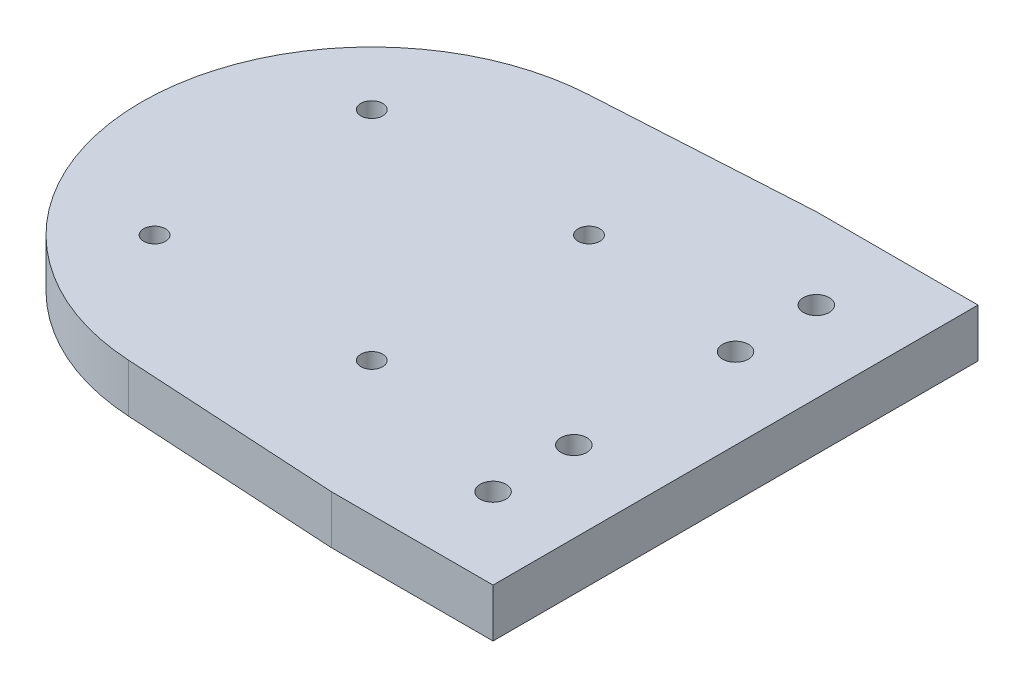
ISO-10303-21;
HEADER;
FILE_DESCRIPTION(('STEP AP214'),'2;1');
FILE_NAME('part.step','',(''),(''),'','','');
FILE_SCHEMA(('AUTOMOTIVE_DESIGN { 1 0 10303 214 1 1 1 1 }'));
ENDSEC;
DATA;
#1=APPLICATION_CONTEXT('core data for automotive mechanical design processes');
#2=APPLICATION_PROTOCOL_DEFINITION('international standard','automotive_design',2000,#1);
#3=PRODUCT_CONTEXT('',#1,'mechanical');
#4=PRODUCT('Part','Part','',(#3));
#5=PRODUCT_RELATED_PRODUCT_CATEGORY('part','',(#4));
#6=PRODUCT_DEFINITION_FORMATION('','',#4);
#7=PRODUCT_DEFINITION_CONTEXT('part definition',#1,'design');
#8=PRODUCT_DEFINITION('design','',#6,#7);
#9=PRODUCT_DEFINITION_SHAPE('','',#8);
#10=(LENGTH_UNIT() NAMED_UNIT(*) SI_UNIT(.MILLI.,.METRE.));
#11=(NAMED_UNIT(*) PLANE_ANGLE_UNIT() SI_UNIT($,.RADIAN.));
#12=(NAMED_UNIT(*) SI_UNIT($,.STERADIAN.) SOLID_ANGLE_UNIT());
#13=UNCERTAINTY_MEASURE_WITH_UNIT(LENGTH_MEASURE(1.E-05),#10,'distance_accuracy_value','');
#14=(GEOMETRIC_REPRESENTATION_CONTEXT(3) GLOBAL_UNCERTAINTY_ASSIGNED_CONTEXT((#13)) GLOBAL_UNIT_ASSIGNED_CONTEXT((#10,
#11,#12)) REPRESENTATION_CONTEXT('',''));
#15=CARTESIAN_POINT('',(0.,0.,0.));
#16=DIRECTION('',(0.,0.,1.));
#17=DIRECTION('',(1.,0.,0.));
#18=AXIS2_PLACEMENT_3D('',#15,#16,#17);
#19=CARTESIAN_POINT('',(45.,6.,-30.));
#20=DIRECTION('',(0.,0.,1.));
#21=DIRECTION('',(1.,0.,0.));
#22=AXIS2_PLACEMENT_3D('',#19,#20,#21);
#23=PLANE('',#22);
#24=DIRECTION('',(-1.,0.,0.));
#25=VECTOR('',#24,1.);
#26=CARTESIAN_POINT('',(45.,0.,-30.));
#27=LINE('',#26,#25);
#28=CARTESIAN_POINT('',(45.,0.,-30.));
#29=VERTEX_POINT('',#28);
#30=CARTESIAN_POINT('',(25.,0.,-30.));
#31=VERTEX_POINT('',#30);
#32=EDGE_CURVE('E131',#29,#31,#27,.T.);
#33=ORIENTED_EDGE('',*,*,#32,.T.);
#34=DIRECTION('',(0.,-1.,0.));
#35=VECTOR('',#34,1.);
#36=CARTESIAN_POINT('',(25.,6.,-30.));
#37=LINE('',#36,#35);
#38=CARTESIAN_POINT('',(25.,6.,-30.));
#39=VERTEX_POINT('',#38);
#40=EDGE_CURVE('E11',#39,#31,#37,.T.);
#41=ORIENTED_EDGE('',*,*,#40,.F.);
#42=DIRECTION('',(-1.,0.,0.));
#43=VECTOR('',#42,1.);
#44=CARTESIAN_POINT('',(45.,6.,-30.));
#45=LINE('',#44,#43);
#46=CARTESIAN_POINT('',(45.,6.,-30.));
#47=VERTEX_POINT('',#46);
#48=EDGE_CURVE('E148',#47,#39,#45,.T.);
#49=ORIENTED_EDGE('',*,*,#48,.F.);
#50=DIRECTION('',(0.,-1.,0.));
#51=VECTOR('',#50,1.);
#52=CARTESIAN_POINT('',(45.,6.,-30.));
#53=LINE('',#52,#51);
#54=EDGE_CURVE('E127',#47,#29,#53,.T.);
#55=ORIENTED_EDGE('',*,*,#54,.T.);
#56=EDGE_LOOP('',(#33,#41,#49,#55));
#57=FACE_BOUND('',#56,.T.);
#58=ADVANCED_FACE('F42',(#57),#23,.F.);
#59=CARTESIAN_POINT('',(25.,6.,-30.));
#60=DIRECTION('',(0.0579812094772124,0.,0.998317674564344));
#61=DIRECTION('',(0.998317674564344,0.,-0.0579812094772124));
#62=AXIS2_PLACEMENT_3D('',#59,#60,#61);
#63=PLANE('',#62);
#64=DIRECTION('',(-0.998317674564344,0.,0.0579812094772124));
#65=VECTOR('',#64,1.);
#66=CARTESIAN_POINT('',(25.,0.,-30.));
#67=LINE('',#66,#65);
#68=CARTESIAN_POINT('',(-1.65246447010055,0.,-28.4520537250838));
#69=VERTEX_POINT('',#68);
#70=EDGE_CURVE('E135',#31,#69,#67,.T.);
#71=ORIENTED_EDGE('',*,*,#70,.T.);
#72=DIRECTION('',(0.,-1.,0.));
#73=VECTOR('',#72,1.);
#74=CARTESIAN_POINT('',(-1.65246447010055,6.,-28.4520537250838));
#75=LINE('',#74,#73);
#76=CARTESIAN_POINT('',(-1.65246447010055,6.,-28.4520537250838));
#77=VERTEX_POINT('',#76);
#78=EDGE_CURVE('E51',#77,#69,#75,.T.);
#79=ORIENTED_EDGE('',*,*,#78,.F.);
#80=DIRECTION('',(-0.998317674564344,0.,0.0579812094772124));
#81=VECTOR('',#80,1.);
#82=CARTESIAN_POINT('',(25.,6.,-30.));
#83=LINE('',#82,#81);
#84=EDGE_CURVE('E96',#39,#77,#83,.T.);
#85=ORIENTED_EDGE('',*,*,#84,.F.);
#86=ORIENTED_EDGE('',*,*,#40,.T.);
#87=EDGE_LOOP('',(#71,#79,#85,#86));
#88=FACE_BOUND('',#87,.T.);
#89=ADVANCED_FACE('F177',(#88),#63,.F.);
#90=CARTESIAN_POINT('',(0.,6.,0.));
#91=DIRECTION('',(0.,-1.,0.));
#92=DIRECTION('',(0.,0.,-1.));
#93=AXIS2_PLACEMENT_3D('',#90,#91,#92);
#94=CYLINDRICAL_SURFACE('',#93,28.5);
#95=CARTESIAN_POINT('',(0.,0.,0.));
#96=DIRECTION('',(0.,1.,0.));
#97=DIRECTION('',(0.,0.,1.));
#98=AXIS2_PLACEMENT_3D('',#95,#96,#97);
#99=CIRCLE('',#98,28.5);
#100=CARTESIAN_POINT('',(-1.65246447010056,0.,28.4520537250838));
#101=VERTEX_POINT('',#100);
#102=EDGE_CURVE('E139',#69,#101,#99,.T.);
#103=ORIENTED_EDGE('',*,*,#102,.T.);
#104=DIRECTION('',(0.,-1.,0.));
#105=VECTOR('',#104,1.);
#106=CARTESIAN_POINT('',(-1.65246447010056,6.,28.4520537250838));
#107=LINE('',#106,#105);
#108=CARTESIAN_POINT('',(-1.65246447010056,6.,28.4520537250838));
#109=VERTEX_POINT('',#108);
#110=EDGE_CURVE('E120',#109,#101,#107,.T.);
#111=ORIENTED_EDGE('',*,*,#110,.F.);
#112=CARTESIAN_POINT('',(0.,6.,0.));
#113=DIRECTION('',(0.,1.,0.));
#114=DIRECTION('',(0.,0.,1.));
#115=AXIS2_PLACEMENT_3D('',#112,#113,#114);
#116=CIRCLE('',#115,28.5);
#117=EDGE_CURVE('E109',#77,#109,#116,.T.);
#118=ORIENTED_EDGE('',*,*,#117,.F.);
#119=ORIENTED_EDGE('',*,*,#78,.T.);
#120=EDGE_LOOP('',(#103,#111,#118,#119));
#121=FACE_BOUND('',#120,.T.);
#122=ADVANCED_FACE('F158',(#121),#94,.T.);
#123=CARTESIAN_POINT('',(25.,6.,30.));
#124=DIRECTION('',(0.0579812094772124,0.,-0.998317674564344));
#125=DIRECTION('',(-0.998317674564344,0.,-0.0579812094772124));
#126=AXIS2_PLACEMENT_3D('',#123,#124,#125);
#127=PLANE('',#126);
#128=DIRECTION('',(0.998317674564344,0.,0.0579812094772124));
#129=VECTOR('',#128,1.);
#130=CARTESIAN_POINT('',(25.,0.,30.));
#131=LINE('',#130,#129);
#132=CARTESIAN_POINT('',(25.,0.,30.));
#133=VERTEX_POINT('',#132);
#134=EDGE_CURVE('E118',#101,#133,#131,.T.);
#135=ORIENTED_EDGE('',*,*,#134,.T.);
#136=DIRECTION('',(0.,-1.,0.));
#137=VECTOR('',#136,1.);
#138=CARTESIAN_POINT('',(25.,6.,30.));
#139=LINE('',#138,#137);
#140=CARTESIAN_POINT('',(25.,6.,30.));
#141=VERTEX_POINT('',#140);
#142=EDGE_CURVE('E115',#141,#133,#139,.T.);
#143=ORIENTED_EDGE('',*,*,#142,.F.);
#144=DIRECTION('',(0.998317674564344,0.,0.0579812094772124));
#145=VECTOR('',#144,1.);
#146=CARTESIAN_POINT('',(25.,6.,30.));
#147=LINE('',#146,#145);
#148=EDGE_CURVE('E103',#109,#141,#147,.T.);
#149=ORIENTED_EDGE('',*,*,#148,.F.);
#150=ORIENTED_EDGE('',*,*,#110,.T.);
#151=EDGE_LOOP('',(#135,#143,#149,#150));
#152=FACE_BOUND('',#151,.T.);
#153=ADVANCED_FACE('F116',(#152),#127,.F.);
#154=CARTESIAN_POINT('',(45.,6.,30.));
#155=DIRECTION('',(0.,0.,-1.));
#156=DIRECTION('',(-1.,0.,0.));
#157=AXIS2_PLACEMENT_3D('',#154,#155,#156);
#158=PLANE('',#157);
#159=DIRECTION('',(1.,0.,0.));
#160=VECTOR('',#159,1.);
#161=CARTESIAN_POINT('',(45.,0.,30.));
#162=LINE('',#161,#160);
#163=CARTESIAN_POINT('',(45.,0.,30.));
#164=VERTEX_POINT('',#163);
#165=EDGE_CURVE('E82',#133,#164,#162,.T.);
#166=ORIENTED_EDGE('',*,*,#165,.T.);
#167=DIRECTION('',(0.,-1.,0.));
#168=VECTOR('',#167,1.);
#169=CARTESIAN_POINT('',(45.,6.,30.));
#170=LINE('',#169,#168);
#171=CARTESIAN_POINT('',(45.,6.,30.));
#172=VERTEX_POINT('',#171);
#173=EDGE_CURVE('E121',#172,#164,#170,.T.);
#174=ORIENTED_EDGE('',*,*,#173,.F.);
#175=DIRECTION('',(1.,0.,0.));
#176=VECTOR('',#175,1.);
#177=CARTESIAN_POINT('',(45.,6.,30.));
#178=LINE('',#177,#176);
#179=EDGE_CURVE('E107',#141,#172,#178,.T.);
#180=ORIENTED_EDGE('',*,*,#179,.F.);
#181=ORIENTED_EDGE('',*,*,#142,.T.);
#182=EDGE_LOOP('',(#166,#174,#180,#181));
#183=FACE_BOUND('',#182,.T.);
#184=ADVANCED_FACE('F123',(#183),#158,.F.);
#185=CARTESIAN_POINT('',(45.,6.,30.));
#186=DIRECTION('',(-1.,0.,0.));
#187=DIRECTION('',(0.,0.,1.));
#188=AXIS2_PLACEMENT_3D('',#185,#186,#187);
#189=PLANE('',#188);
#190=DIRECTION('',(0.,0.,-1.));
#191=VECTOR('',#190,1.);
#192=CARTESIAN_POINT('',(45.,0.,30.));
#193=LINE('',#192,#191);
#194=EDGE_CURVE('E88',#164,#29,#193,.T.);
#195=ORIENTED_EDGE('',*,*,#194,.T.);
#196=ORIENTED_EDGE('',*,*,#54,.F.);
#197=DIRECTION('',(0.,0.,-1.));
#198=VECTOR('',#197,1.);
#199=CARTESIAN_POINT('',(45.,6.,30.));
#200=LINE('',#199,#198);
#201=EDGE_CURVE('E59',#172,#47,#200,.T.);
#202=ORIENTED_EDGE('',*,*,#201,.F.);
#203=ORIENTED_EDGE('',*,*,#173,.T.);
#204=EDGE_LOOP('',(#195,#196,#202,#203));
#205=FACE_BOUND('',#204,.T.);
#206=ADVANCED_FACE('F165',(#205),#189,.F.);
#207=CARTESIAN_POINT('',(0.,6.,0.));
#208=DIRECTION('',(0.,1.,0.));
#209=DIRECTION('',(0.,0.,1.));
#210=AXIS2_PLACEMENT_3D('',#207,#208,#209);
#211=PLANE('',#210);
#212=CARTESIAN_POINT('',(35.,6.,-20.));
#213=DIRECTION('',(0.,1.,0.));
#214=DIRECTION('',(0.,0.,1.));
#215=AXIS2_PLACEMENT_3D('',#212,#213,#214);
#216=CIRCLE('',#215,1.6);
#217=CARTESIAN_POINT('',(35.,6.,-18.4));
#218=VERTEX_POINT('',#217);
#219=EDGE_CURVE('E349',#218,#218,#216,.T.);
#220=ORIENTED_EDGE('',*,*,#219,.F.);
#221=EDGE_LOOP('',(#220));
#222=FACE_BOUND('',#221,.T.);
#223=CARTESIAN_POINT('',(35.,6.,9.99999999999999));
#224=DIRECTION('',(0.,1.,0.));
#225=DIRECTION('',(0.,0.,-1.));
#226=AXIS2_PLACEMENT_3D('',#223,#224,#225);
#227=CIRCLE('',#226,1.6);
#228=CARTESIAN_POINT('',(35.,6.,8.4));
#229=VERTEX_POINT('',#228);
#230=EDGE_CURVE('E365',#229,#229,#227,.T.);
#231=ORIENTED_EDGE('',*,*,#230,.F.);
#232=EDGE_LOOP('',(#231));
#233=FACE_BOUND('',#232,.T.);
#234=CARTESIAN_POINT('',(35.,6.,20.));
#235=DIRECTION('',(0.,1.,0.));
#236=DIRECTION('',(0.,0.,-1.));
#237=AXIS2_PLACEMENT_3D('',#234,#235,#236);
#238=CIRCLE('',#237,1.6);
#239=CARTESIAN_POINT('',(35.,6.,18.4));
#240=VERTEX_POINT('',#239);
#241=EDGE_CURVE('E372',#240,#240,#238,.T.);
#242=ORIENTED_EDGE('',*,*,#241,.F.);
#243=EDGE_LOOP('',(#242));
#244=FACE_BOUND('',#243,.T.);
#245=CARTESIAN_POINT('',(35.,6.,-9.99999999999999));
#246=DIRECTION('',(0.,1.,0.));
#247=DIRECTION('',(0.,0.,1.));
#248=AXIS2_PLACEMENT_3D('',#245,#246,#247);
#249=CIRCLE('',#248,1.6);
#250=CARTESIAN_POINT('',(35.,6.,-8.4));
#251=VERTEX_POINT('',#250);
#252=EDGE_CURVE('E351',#251,#251,#249,.T.);
#253=ORIENTED_EDGE('',*,*,#252,.F.);
#254=EDGE_LOOP('',(#253));
#255=FACE_BOUND('',#254,.T.);
#256=CARTESIAN_POINT('',(-13.4350288425444,6.,13.4350288425444));
#257=DIRECTION('',(0.,1.,0.));
#258=DIRECTION('',(0.,0.,1.));
#259=AXIS2_PLACEMENT_3D('',#256,#257,#258);
#260=CIRCLE('',#259,1.35);
#261=CARTESIAN_POINT('',(-13.4350288425444,6.,14.7850288425444));
#262=VERTEX_POINT('',#261);
#263=EDGE_CURVE('E394',#262,#262,#260,.T.);
#264=ORIENTED_EDGE('',*,*,#263,.F.);
#265=EDGE_LOOP('',(#264));
#266=FACE_BOUND('',#265,.T.);
#267=CARTESIAN_POINT('',(13.4350288425444,6.,13.4350288425444));
#268=DIRECTION('',(0.,1.,0.));
#269=DIRECTION('',(0.,0.,1.));
#270=AXIS2_PLACEMENT_3D('',#267,#268,#269);
#271=CIRCLE('',#270,1.35);
#272=CARTESIAN_POINT('',(13.4350288425444,6.,14.7850288425444));
#273=VERTEX_POINT('',#272);
#274=EDGE_CURVE('E385',#273,#273,#271,.T.);
#275=ORIENTED_EDGE('',*,*,#274,.F.);
#276=EDGE_LOOP('',(#275));
#277=FACE_BOUND('',#276,.T.);
#278=CARTESIAN_POINT('',(13.4350288425444,6.,-13.4350288425444));
#279=DIRECTION('',(0.,1.,0.));
#280=DIRECTION('',(0.,0.,1.));
#281=AXIS2_PLACEMENT_3D('',#278,#279,#280);
#282=CIRCLE('',#281,1.35);
#283=CARTESIAN_POINT('',(13.4350288425444,6.,-12.0850288425444));
#284=VERTEX_POINT('',#283);
#285=EDGE_CURVE('E384',#284,#284,#282,.T.);
#286=ORIENTED_EDGE('',*,*,#285,.F.);
#287=EDGE_LOOP('',(#286));
#288=FACE_BOUND('',#287,.T.);
#289=CARTESIAN_POINT('',(-13.4350288425444,6.,-13.4350288425444));
#290=DIRECTION('',(0.,1.,0.));
#291=DIRECTION('',(0.,0.,1.));
#292=AXIS2_PLACEMENT_3D('',#289,#290,#291);
#293=CIRCLE('',#292,1.35);
#294=CARTESIAN_POINT('',(-13.4350288425444,6.,-12.0850288425444));
#295=VERTEX_POINT('',#294);
#296=EDGE_CURVE('E389',#295,#295,#293,.T.);
#297=ORIENTED_EDGE('',*,*,#296,.F.);
#298=EDGE_LOOP('',(#297));
#299=FACE_BOUND('',#298,.T.);
#300=ORIENTED_EDGE('',*,*,#48,.T.);
#301=ORIENTED_EDGE('',*,*,#84,.T.);
#302=ORIENTED_EDGE('',*,*,#117,.T.);
#303=ORIENTED_EDGE('',*,*,#148,.T.);
#304=ORIENTED_EDGE('',*,*,#179,.T.);
#305=ORIENTED_EDGE('',*,*,#201,.T.);
#306=EDGE_LOOP('',(#300,#301,#302,#303,#304,#305));
#307=FACE_BOUND('',#306,.T.);
#308=ADVANCED_FACE('F105',(#222,#233,#244,#255,#266,#277,#288,#299,#307),#211,.T.);
#309=CARTESIAN_POINT('',(0.,0.,0.));
#310=DIRECTION('',(0.,1.,0.));
#311=DIRECTION('',(0.,0.,1.));
#312=AXIS2_PLACEMENT_3D('',#309,#310,#311);
#313=PLANE('',#312);
#314=CARTESIAN_POINT('',(35.,0.,-20.));
#315=DIRECTION('',(0.,1.,0.));
#316=DIRECTION('',(0.,0.,1.));
#317=AXIS2_PLACEMENT_3D('',#314,#315,#316);
#318=CIRCLE('',#317,1.6);
#319=CARTESIAN_POINT('',(35.,0.,-18.4));
#320=VERTEX_POINT('',#319);
#321=EDGE_CURVE('E346',#320,#320,#318,.F.);
#322=ORIENTED_EDGE('',*,*,#321,.F.);
#323=EDGE_LOOP('',(#322));
#324=FACE_BOUND('',#323,.T.);
#325=CARTESIAN_POINT('',(35.,0.,9.99999999999999));
#326=DIRECTION('',(0.,1.,0.));
#327=DIRECTION('',(0.,0.,1.));
#328=AXIS2_PLACEMENT_3D('',#325,#326,#327);
#329=CIRCLE('',#328,1.6);
#330=CARTESIAN_POINT('',(35.,0.,11.6));
#331=VERTEX_POINT('',#330);
#332=EDGE_CURVE('E361',#331,#331,#329,.F.);
#333=ORIENTED_EDGE('',*,*,#332,.F.);
#334=EDGE_LOOP('',(#333));
#335=FACE_BOUND('',#334,.T.);
#336=CARTESIAN_POINT('',(35.,0.,20.));
#337=DIRECTION('',(0.,1.,0.));
#338=DIRECTION('',(0.,0.,1.));
#339=AXIS2_PLACEMENT_3D('',#336,#337,#338);
#340=CIRCLE('',#339,1.6);
#341=CARTESIAN_POINT('',(35.,0.,21.6));
#342=VERTEX_POINT('',#341);
#343=EDGE_CURVE('E369',#342,#342,#340,.F.);
#344=ORIENTED_EDGE('',*,*,#343,.F.);
#345=EDGE_LOOP('',(#344));
#346=FACE_BOUND('',#345,.T.);
#347=CARTESIAN_POINT('',(35.,0.,-9.99999999999999));
#348=DIRECTION('',(0.,1.,0.));
#349=DIRECTION('',(0.,0.,1.));
#350=AXIS2_PLACEMENT_3D('',#347,#348,#349);
#351=CIRCLE('',#350,1.6);
#352=CARTESIAN_POINT('',(35.,0.,-8.4));
#353=VERTEX_POINT('',#352);
#354=EDGE_CURVE('E358',#353,#353,#351,.F.);
#355=ORIENTED_EDGE('',*,*,#354,.F.);
#356=EDGE_LOOP('',(#355));
#357=FACE_BOUND('',#356,.T.);
#358=CARTESIAN_POINT('',(-13.4350288425444,0.,13.4350288425444));
#359=DIRECTION('',(0.,1.,0.));
#360=DIRECTION('',(0.,0.,1.));
#361=AXIS2_PLACEMENT_3D('',#358,#359,#360);
#362=CIRCLE('',#361,1.35);
#363=CARTESIAN_POINT('',(-13.4350288425444,0.,14.7850288425444));
#364=VERTEX_POINT('',#363);
#365=EDGE_CURVE('E355',#364,#364,#362,.F.);
#366=ORIENTED_EDGE('',*,*,#365,.F.);
#367=EDGE_LOOP('',(#366));
#368=FACE_BOUND('',#367,.T.);
#369=CARTESIAN_POINT('',(13.4350288425444,0.,13.4350288425444));
#370=DIRECTION('',(0.,1.,0.));
#371=DIRECTION('',(0.,0.,1.));
#372=AXIS2_PLACEMENT_3D('',#369,#370,#371);
#373=CIRCLE('',#372,1.35);
#374=CARTESIAN_POINT('',(13.4350288425444,0.,14.7850288425444));
#375=VERTEX_POINT('',#374);
#376=EDGE_CURVE('E390',#375,#375,#373,.F.);
#377=ORIENTED_EDGE('',*,*,#376,.F.);
#378=EDGE_LOOP('',(#377));
#379=FACE_BOUND('',#378,.T.);
#380=CARTESIAN_POINT('',(13.4350288425444,0.,-13.4350288425444));
#381=DIRECTION('',(0.,1.,0.));
#382=DIRECTION('',(0.,0.,1.));
#383=AXIS2_PLACEMENT_3D('',#380,#381,#382);
#384=CIRCLE('',#383,1.35);
#385=CARTESIAN_POINT('',(13.4350288425444,0.,-12.0850288425444));
#386=VERTEX_POINT('',#385);
#387=EDGE_CURVE('E380',#386,#386,#384,.F.);
#388=ORIENTED_EDGE('',*,*,#387,.F.);
#389=EDGE_LOOP('',(#388));
#390=FACE_BOUND('',#389,.T.);
#391=CARTESIAN_POINT('',(-13.4350288425444,0.,-13.4350288425444));
#392=DIRECTION('',(0.,1.,0.));
#393=DIRECTION('',(0.,0.,1.));
#394=AXIS2_PLACEMENT_3D('',#391,#392,#393);
#395=CIRCLE('',#394,1.35);
#396=CARTESIAN_POINT('',(-13.4350288425444,0.,-12.0850288425444));
#397=VERTEX_POINT('',#396);
#398=EDGE_CURVE('E136',#397,#397,#395,.F.);
#399=ORIENTED_EDGE('',*,*,#398,.F.);
#400=EDGE_LOOP('',(#399));
#401=FACE_BOUND('',#400,.T.);
#402=ORIENTED_EDGE('',*,*,#32,.F.);
#403=ORIENTED_EDGE('',*,*,#194,.F.);
#404=ORIENTED_EDGE('',*,*,#165,.F.);
#405=ORIENTED_EDGE('',*,*,#134,.F.);
#406=ORIENTED_EDGE('',*,*,#102,.F.);
#407=ORIENTED_EDGE('',*,*,#70,.F.);
#408=EDGE_LOOP('',(#402,#403,#404,#405,#406,#407));
#409=FACE_BOUND('',#408,.T.);
#410=ADVANCED_FACE('F161',(#324,#335,#346,#357,#368,#379,#390,#401,#409),#313,.F.);
#411=CARTESIAN_POINT('',(-13.4350288425444,-3.81837661840736,-13.4350288425444));
#412=DIRECTION('',(0.,1.,0.));
#413=DIRECTION('',(0.,0.,1.));
#414=AXIS2_PLACEMENT_3D('',#411,#412,#413);
#415=CYLINDRICAL_SURFACE('',#414,1.35);
#416=CARTESIAN_POINT('',(-13.4350288425444,0.,-12.0850288425444));
#417=CARTESIAN_POINT('',(-13.4350288425444,0.0624999999999995,-12.0850288425444));
#418=CARTESIAN_POINT('',(-13.4350288425444,0.124999999999999,-12.0850288425444));
#419=CARTESIAN_POINT('',(-13.4350288425444,0.249999999999999,-12.0850288425444));
#420=CARTESIAN_POINT('',(-13.4350288425444,0.312499999999999,-12.0850288425444));
#421=CARTESIAN_POINT('',(-13.4350288425444,0.4375,-12.0850288425444));
#422=CARTESIAN_POINT('',(-13.4350288425444,0.5,-12.0850288425444));
#423=CARTESIAN_POINT('',(-13.4350288425444,0.625,-12.0850288425444));
#424=CARTESIAN_POINT('',(-13.4350288425444,0.6875,-12.0850288425444));
#425=CARTESIAN_POINT('',(-13.4350288425444,0.8125,-12.0850288425444));
#426=CARTESIAN_POINT('',(-13.4350288425444,0.874999999999999,-12.0850288425444));
#427=CARTESIAN_POINT('',(-13.4350288425444,0.999999999999999,-12.0850288425444));
#428=CARTESIAN_POINT('',(-13.4350288425444,1.0625,-12.0850288425444));
#429=CARTESIAN_POINT('',(-13.4350288425444,1.1875,-12.0850288425444));
#430=CARTESIAN_POINT('',(-13.4350288425444,1.25,-12.0850288425444));
#431=CARTESIAN_POINT('',(-13.4350288425444,1.375,-12.0850288425444));
#432=CARTESIAN_POINT('',(-13.4350288425444,1.4375,-12.0850288425444));
#433=CARTESIAN_POINT('',(-13.4350288425444,1.5625,-12.0850288425444));
#434=CARTESIAN_POINT('',(-13.4350288425444,1.625,-12.0850288425444));
#435=CARTESIAN_POINT('',(-13.4350288425444,1.75,-12.0850288425444));
#436=CARTESIAN_POINT('',(-13.4350288425444,1.8125,-12.0850288425444));
#437=CARTESIAN_POINT('',(-13.4350288425444,1.9375,-12.0850288425444));
#438=CARTESIAN_POINT('',(-13.4350288425444,2.,-12.0850288425444));
#439=CARTESIAN_POINT('',(-13.4350288425444,2.125,-12.0850288425444));
#440=CARTESIAN_POINT('',(-13.4350288425444,2.1875,-12.0850288425444));
#441=CARTESIAN_POINT('',(-13.4350288425444,2.3125,-12.0850288425444));
#442=CARTESIAN_POINT('',(-13.4350288425444,2.375,-12.0850288425444));
#443=CARTESIAN_POINT('',(-13.4350288425444,2.5,-12.0850288425444));
#444=CARTESIAN_POINT('',(-13.4350288425444,2.5625,-12.0850288425444));
#445=CARTESIAN_POINT('',(-13.4350288425444,2.6875,-12.0850288425444));
#446=CARTESIAN_POINT('',(-13.4350288425444,2.75,-12.0850288425444));
#447=CARTESIAN_POINT('',(-13.4350288425444,2.875,-12.0850288425444));
#448=CARTESIAN_POINT('',(-13.4350288425444,2.9375,-12.0850288425444));
#449=CARTESIAN_POINT('',(-13.4350288425444,3.0625,-12.0850288425444));
#450=CARTESIAN_POINT('',(-13.4350288425444,3.125,-12.0850288425444));
#451=CARTESIAN_POINT('',(-13.4350288425444,3.25,-12.0850288425444));
#452=CARTESIAN_POINT('',(-13.4350288425444,3.3125,-12.0850288425444));
#453=CARTESIAN_POINT('',(-13.4350288425444,3.4375,-12.0850288425444));
#454=CARTESIAN_POINT('',(-13.4350288425444,3.5,-12.0850288425444));
#455=CARTESIAN_POINT('',(-13.4350288425444,3.625,-12.0850288425444));
#456=CARTESIAN_POINT('',(-13.4350288425444,3.6875,-12.0850288425444));
#457=CARTESIAN_POINT('',(-13.4350288425444,3.8125,-12.0850288425444));
#458=CARTESIAN_POINT('',(-13.4350288425444,3.875,-12.0850288425444));
#459=CARTESIAN_POINT('',(-13.4350288425444,4.,-12.0850288425444));
#460=CARTESIAN_POINT('',(-13.4350288425444,4.0625,-12.0850288425444));
#461=CARTESIAN_POINT('',(-13.4350288425444,4.1875,-12.0850288425444));
#462=CARTESIAN_POINT('',(-13.4350288425444,4.25,-12.0850288425444));
#463=CARTESIAN_POINT('',(-13.4350288425444,4.375,-12.0850288425444));
#464=CARTESIAN_POINT('',(-13.4350288425444,4.4375,-12.0850288425444));
#465=CARTESIAN_POINT('',(-13.4350288425444,4.5625,-12.0850288425444));
#466=CARTESIAN_POINT('',(-13.4350288425444,4.625,-12.0850288425444));
#467=CARTESIAN_POINT('',(-13.4350288425444,4.75,-12.0850288425444));
#468=CARTESIAN_POINT('',(-13.4350288425444,4.8125,-12.0850288425444));
#469=CARTESIAN_POINT('',(-13.4350288425444,4.9375,-12.0850288425444));
#470=CARTESIAN_POINT('',(-13.4350288425444,5.,-12.0850288425444));
#471=CARTESIAN_POINT('',(-13.4350288425444,5.125,-12.0850288425444));
#472=CARTESIAN_POINT('',(-13.4350288425444,5.1875,-12.0850288425444));
#473=CARTESIAN_POINT('',(-13.4350288425444,5.3125,-12.0850288425444));
#474=CARTESIAN_POINT('',(-13.4350288425444,5.375,-12.0850288425444));
#475=CARTESIAN_POINT('',(-13.4350288425444,5.5,-12.0850288425444));
#476=CARTESIAN_POINT('',(-13.4350288425444,5.5625,-12.0850288425444));
#477=CARTESIAN_POINT('',(-13.4350288425444,5.6875,-12.0850288425444));
#478=CARTESIAN_POINT('',(-13.4350288425444,5.75,-12.0850288425444));
#479=CARTESIAN_POINT('',(-13.4350288425444,5.875,-12.0850288425444));
#480=CARTESIAN_POINT('',(-13.4350288425444,5.9375,-12.0850288425444));
#481=CARTESIAN_POINT('',(-13.4350288425444,6.,-12.0850288425444));
#482=B_SPLINE_CURVE_WITH_KNOTS('',3,(#416,#417,#418,#419,#420,#421,#422,#423,#424,#425,#426,
#427,#428,#429,#430,#431,#432,#433,#434,#435,#436,#437,#438,#439,#440,#441,#442,#443,#444,#445,
#446,#447,#448,#449,#450,#451,#452,#453,#454,#455,#456,#457,#458,#459,#460,#461,#462,#463,#464,
#465,#466,#467,#468,#469,#470,#471,#472,#473,#474,#475,#476,#477,#478,#479,#480,#481),
.UNSPECIFIED.,.F.,.F.,(4,2,2,2,2,2,2,2,2,2,2,2,2,2,2,2,2,2,2,2,2,2,2,2,2,2,2,2,2,2,2,2,4),(0.,
0.1875,0.375,0.5625,0.75,0.9375,1.125,1.3125,1.5,1.6875,1.875,2.0625,2.25,2.4375,2.625,2.8125,
3.,3.1875,3.375,3.5625,3.75,3.9375,4.125,4.3125,4.5,4.6875,4.875,5.0625,5.25,5.4375,5.625,
5.8125,6.),.UNSPECIFIED.);
#483=EDGE_CURVE('BSEAM207',#397,#295,#482,.T.);
#484=ORIENTED_EDGE('',*,*,#398,.T.);
#485=ORIENTED_EDGE('',*,*,#296,.T.);
#486=ORIENTED_EDGE('',*,*,#483,.T.);
#487=ORIENTED_EDGE('',*,*,#483,.F.);
#488=EDGE_LOOP('',(#484,#486,#485,#487));
#489=FACE_BOUND('',#488,.T.);
#490=ADVANCED_FACE('F207',(#489),#415,.F.);
#491=CARTESIAN_POINT('',(13.4350288425444,-3.81837661840736,-13.4350288425444));
#492=DIRECTION('',(0.,1.,0.));
#493=DIRECTION('',(0.,0.,1.));
#494=AXIS2_PLACEMENT_3D('',#491,#492,#493);
#495=CYLINDRICAL_SURFACE('',#494,1.35);
#496=CARTESIAN_POINT('',(13.4350288425444,0.,-12.0850288425444));
#497=CARTESIAN_POINT('',(13.4350288425444,0.0624999999999995,-12.0850288425444));
#498=CARTESIAN_POINT('',(13.4350288425444,0.124999999999999,-12.0850288425444));
#499=CARTESIAN_POINT('',(13.4350288425444,0.249999999999999,-12.0850288425444));
#500=CARTESIAN_POINT('',(13.4350288425444,0.312499999999999,-12.0850288425444));
#501=CARTESIAN_POINT('',(13.4350288425444,0.4375,-12.0850288425444));
#502=CARTESIAN_POINT('',(13.4350288425444,0.5,-12.0850288425444));
#503=CARTESIAN_POINT('',(13.4350288425444,0.625,-12.0850288425444));
#504=CARTESIAN_POINT('',(13.4350288425444,0.6875,-12.0850288425444));
#505=CARTESIAN_POINT('',(13.4350288425444,0.8125,-12.0850288425444));
#506=CARTESIAN_POINT('',(13.4350288425444,0.874999999999999,-12.0850288425444));
#507=CARTESIAN_POINT('',(13.4350288425444,0.999999999999999,-12.0850288425444));
#508=CARTESIAN_POINT('',(13.4350288425444,1.0625,-12.0850288425444));
#509=CARTESIAN_POINT('',(13.4350288425444,1.1875,-12.0850288425444));
#510=CARTESIAN_POINT('',(13.4350288425444,1.25,-12.0850288425444));
#511=CARTESIAN_POINT('',(13.4350288425444,1.375,-12.0850288425444));
#512=CARTESIAN_POINT('',(13.4350288425444,1.4375,-12.0850288425444));
#513=CARTESIAN_POINT('',(13.4350288425444,1.5625,-12.0850288425444));
#514=CARTESIAN_POINT('',(13.4350288425444,1.625,-12.0850288425444));
#515=CARTESIAN_POINT('',(13.4350288425444,1.75,-12.0850288425444));
#516=CARTESIAN_POINT('',(13.4350288425444,1.8125,-12.0850288425444));
#517=CARTESIAN_POINT('',(13.4350288425444,1.9375,-12.0850288425444));
#518=CARTESIAN_POINT('',(13.4350288425444,2.,-12.0850288425444));
#519=CARTESIAN_POINT('',(13.4350288425444,2.125,-12.0850288425444));
#520=CARTESIAN_POINT('',(13.4350288425444,2.1875,-12.0850288425444));
#521=CARTESIAN_POINT('',(13.4350288425444,2.3125,-12.0850288425444));
#522=CARTESIAN_POINT('',(13.4350288425444,2.375,-12.0850288425444));
#523=CARTESIAN_POINT('',(13.4350288425444,2.5,-12.0850288425444));
#524=CARTESIAN_POINT('',(13.4350288425444,2.5625,-12.0850288425444));
#525=CARTESIAN_POINT('',(13.4350288425444,2.6875,-12.0850288425444));
#526=CARTESIAN_POINT('',(13.4350288425444,2.75,-12.0850288425444));
#527=CARTESIAN_POINT('',(13.4350288425444,2.875,-12.0850288425444));
#528=CARTESIAN_POINT('',(13.4350288425444,2.9375,-12.0850288425444));
#529=CARTESIAN_POINT('',(13.4350288425444,3.0625,-12.0850288425444));
#530=CARTESIAN_POINT('',(13.4350288425444,3.125,-12.0850288425444));
#531=CARTESIAN_POINT('',(13.4350288425444,3.25,-12.0850288425444));
#532=CARTESIAN_POINT('',(13.4350288425444,3.3125,-12.0850288425444));
#533=CARTESIAN_POINT('',(13.4350288425444,3.4375,-12.0850288425444));
#534=CARTESIAN_POINT('',(13.4350288425444,3.5,-12.0850288425444));
#535=CARTESIAN_POINT('',(13.4350288425444,3.625,-12.0850288425444));
#536=CARTESIAN_POINT('',(13.4350288425444,3.6875,-12.0850288425444));
#537=CARTESIAN_POINT('',(13.4350288425444,3.8125,-12.0850288425444));
#538=CARTESIAN_POINT('',(13.4350288425444,3.875,-12.0850288425444));
#539=CARTESIAN_POINT('',(13.4350288425444,4.,-12.0850288425444));
#540=CARTESIAN_POINT('',(13.4350288425444,4.0625,-12.0850288425444));
#541=CARTESIAN_POINT('',(13.4350288425444,4.1875,-12.0850288425444));
#542=CARTESIAN_POINT('',(13.4350288425444,4.25,-12.0850288425444));
#543=CARTESIAN_POINT('',(13.4350288425444,4.375,-12.0850288425444));
#544=CARTESIAN_POINT('',(13.4350288425444,4.4375,-12.0850288425444));
#545=CARTESIAN_POINT('',(13.4350288425444,4.5625,-12.0850288425444));
#546=CARTESIAN_POINT('',(13.4350288425444,4.625,-12.0850288425444));
#547=CARTESIAN_POINT('',(13.4350288425444,4.75,-12.0850288425444));
#548=CARTESIAN_POINT('',(13.4350288425444,4.8125,-12.0850288425444));
#549=CARTESIAN_POINT('',(13.4350288425444,4.9375,-12.0850288425444));
#550=CARTESIAN_POINT('',(13.4350288425444,5.,-12.0850288425444));
#551=CARTESIAN_POINT('',(13.4350288425444,5.125,-12.0850288425444));
#552=CARTESIAN_POINT('',(13.4350288425444,5.1875,-12.0850288425444));
#553=CARTESIAN_POINT('',(13.4350288425444,5.3125,-12.0850288425444));
#554=CARTESIAN_POINT('',(13.4350288425444,5.375,-12.0850288425444));
#555=CARTESIAN_POINT('',(13.4350288425444,5.5,-12.0850288425444));
#556=CARTESIAN_POINT('',(13.4350288425444,5.5625,-12.0850288425444));
#557=CARTESIAN_POINT('',(13.4350288425444,5.6875,-12.0850288425444));
#558=CARTESIAN_POINT('',(13.4350288425444,5.75,-12.0850288425444));
#559=CARTESIAN_POINT('',(13.4350288425444,5.875,-12.0850288425444));
#560=CARTESIAN_POINT('',(13.4350288425444,5.9375,-12.0850288425444));
#561=CARTESIAN_POINT('',(13.4350288425444,6.,-12.0850288425444));
#562=B_SPLINE_CURVE_WITH_KNOTS('',3,(#496,#497,#498,#499,#500,#501,#502,#503,#504,#505,#506,
#507,#508,#509,#510,#511,#512,#513,#514,#515,#516,#517,#518,#519,#520,#521,#522,#523,#524,#525,
#526,#527,#528,#529,#530,#531,#532,#533,#534,#535,#536,#537,#538,#539,#540,#541,#542,#543,#544,
#545,#546,#547,#548,#549,#550,#551,#552,#553,#554,#555,#556,#557,#558,#559,#560,#561),
.UNSPECIFIED.,.F.,.F.,(4,2,2,2,2,2,2,2,2,2,2,2,2,2,2,2,2,2,2,2,2,2,2,2,2,2,2,2,2,2,2,2,4),(0.,
0.1875,0.375,0.5625,0.75,0.9375,1.125,1.3125,1.5,1.6875,1.875,2.0625,2.25,2.4375,2.625,2.8125,
3.,3.1875,3.375,3.5625,3.75,3.9375,4.125,4.3125,4.5,4.6875,4.875,5.0625,5.25,5.4375,5.625,
5.8125,6.),.UNSPECIFIED.);
#563=EDGE_CURVE('BSEAM212',#386,#284,#562,.T.);
#564=ORIENTED_EDGE('',*,*,#387,.T.);
#565=ORIENTED_EDGE('',*,*,#285,.T.);
#566=ORIENTED_EDGE('',*,*,#563,.T.);
#567=ORIENTED_EDGE('',*,*,#563,.F.);
#568=EDGE_LOOP('',(#564,#566,#565,#567));
#569=FACE_BOUND('',#568,.T.);
#570=ADVANCED_FACE('F212',(#569),#495,.F.);
#571=CARTESIAN_POINT('',(13.4350288425444,-3.81837661840736,13.4350288425444));
#572=DIRECTION('',(0.,1.,0.));
#573=DIRECTION('',(0.,0.,1.));
#574=AXIS2_PLACEMENT_3D('',#571,#572,#573);
#575=CYLINDRICAL_SURFACE('',#574,1.35);
#576=CARTESIAN_POINT('',(13.4350288425444,0.,14.7850288425444));
#577=CARTESIAN_POINT('',(13.4350288425444,0.0624999999999995,14.7850288425444));
#578=CARTESIAN_POINT('',(13.4350288425444,0.124999999999999,14.7850288425444));
#579=CARTESIAN_POINT('',(13.4350288425444,0.249999999999999,14.7850288425444));
#580=CARTESIAN_POINT('',(13.4350288425444,0.312499999999999,14.7850288425444));
#581=CARTESIAN_POINT('',(13.4350288425444,0.4375,14.7850288425444));
#582=CARTESIAN_POINT('',(13.4350288425444,0.5,14.7850288425444));
#583=CARTESIAN_POINT('',(13.4350288425444,0.625,14.7850288425444));
#584=CARTESIAN_POINT('',(13.4350288425444,0.6875,14.7850288425444));
#585=CARTESIAN_POINT('',(13.4350288425444,0.8125,14.7850288425444));
#586=CARTESIAN_POINT('',(13.4350288425444,0.874999999999999,14.7850288425444));
#587=CARTESIAN_POINT('',(13.4350288425444,0.999999999999999,14.7850288425444));
#588=CARTESIAN_POINT('',(13.4350288425444,1.0625,14.7850288425444));
#589=CARTESIAN_POINT('',(13.4350288425444,1.1875,14.7850288425444));
#590=CARTESIAN_POINT('',(13.4350288425444,1.25,14.7850288425444));
#591=CARTESIAN_POINT('',(13.4350288425444,1.375,14.7850288425444));
#592=CARTESIAN_POINT('',(13.4350288425444,1.4375,14.7850288425444));
#593=CARTESIAN_POINT('',(13.4350288425444,1.5625,14.7850288425444));
#594=CARTESIAN_POINT('',(13.4350288425444,1.625,14.7850288425444));
#595=CARTESIAN_POINT('',(13.4350288425444,1.75,14.7850288425444));
#596=CARTESIAN_POINT('',(13.4350288425444,1.8125,14.7850288425444));
#597=CARTESIAN_POINT('',(13.4350288425444,1.9375,14.7850288425444));
#598=CARTESIAN_POINT('',(13.4350288425444,2.,14.7850288425444));
#599=CARTESIAN_POINT('',(13.4350288425444,2.125,14.7850288425444));
#600=CARTESIAN_POINT('',(13.4350288425444,2.1875,14.7850288425444));
#601=CARTESIAN_POINT('',(13.4350288425444,2.3125,14.7850288425444));
#602=CARTESIAN_POINT('',(13.4350288425444,2.375,14.7850288425444));
#603=CARTESIAN_POINT('',(13.4350288425444,2.5,14.7850288425444));
#604=CARTESIAN_POINT('',(13.4350288425444,2.5625,14.7850288425444));
#605=CARTESIAN_POINT('',(13.4350288425444,2.6875,14.7850288425444));
#606=CARTESIAN_POINT('',(13.4350288425444,2.75,14.7850288425444));
#607=CARTESIAN_POINT('',(13.4350288425444,2.875,14.7850288425444));
#608=CARTESIAN_POINT('',(13.4350288425444,2.9375,14.7850288425444));
#609=CARTESIAN_POINT('',(13.4350288425444,3.0625,14.7850288425444));
#610=CARTESIAN_POINT('',(13.4350288425444,3.125,14.7850288425444));
#611=CARTESIAN_POINT('',(13.4350288425444,3.25,14.7850288425444));
#612=CARTESIAN_POINT('',(13.4350288425444,3.3125,14.7850288425444));
#613=CARTESIAN_POINT('',(13.4350288425444,3.4375,14.7850288425444));
#614=CARTESIAN_POINT('',(13.4350288425444,3.5,14.7850288425444));
#615=CARTESIAN_POINT('',(13.4350288425444,3.625,14.7850288425444));
#616=CARTESIAN_POINT('',(13.4350288425444,3.6875,14.7850288425444));
#617=CARTESIAN_POINT('',(13.4350288425444,3.8125,14.7850288425444));
#618=CARTESIAN_POINT('',(13.4350288425444,3.875,14.7850288425444));
#619=CARTESIAN_POINT('',(13.4350288425444,4.,14.7850288425444));
#620=CARTESIAN_POINT('',(13.4350288425444,4.0625,14.7850288425444));
#621=CARTESIAN_POINT('',(13.4350288425444,4.1875,14.7850288425444));
#622=CARTESIAN_POINT('',(13.4350288425444,4.25,14.7850288425444));
#623=CARTESIAN_POINT('',(13.4350288425444,4.375,14.7850288425444));
#624=CARTESIAN_POINT('',(13.4350288425444,4.4375,14.7850288425444));
#625=CARTESIAN_POINT('',(13.4350288425444,4.5625,14.7850288425444));
#626=CARTESIAN_POINT('',(13.4350288425444,4.625,14.7850288425444));
#627=CARTESIAN_POINT('',(13.4350288425444,4.75,14.7850288425444));
#628=CARTESIAN_POINT('',(13.4350288425444,4.8125,14.7850288425444));
#629=CARTESIAN_POINT('',(13.4350288425444,4.9375,14.7850288425444));
#630=CARTESIAN_POINT('',(13.4350288425444,5.,14.7850288425444));
#631=CARTESIAN_POINT('',(13.4350288425444,5.125,14.7850288425444));
#632=CARTESIAN_POINT('',(13.4350288425444,5.1875,14.7850288425444));
#633=CARTESIAN_POINT('',(13.4350288425444,5.3125,14.7850288425444));
#634=CARTESIAN_POINT('',(13.4350288425444,5.375,14.7850288425444));
#635=CARTESIAN_POINT('',(13.4350288425444,5.5,14.7850288425444));
#636=CARTESIAN_POINT('',(13.4350288425444,5.5625,14.7850288425444));
#637=CARTESIAN_POINT('',(13.4350288425444,5.6875,14.7850288425444));
#638=CARTESIAN_POINT('',(13.4350288425444,5.75,14.7850288425444));
#639=CARTESIAN_POINT('',(13.4350288425444,5.875,14.7850288425444));
#640=CARTESIAN_POINT('',(13.4350288425444,5.9375,14.7850288425444));
#641=CARTESIAN_POINT('',(13.4350288425444,6.,14.7850288425444));
#642=B_SPLINE_CURVE_WITH_KNOTS('',3,(#576,#577,#578,#579,#580,#581,#582,#583,#584,#585,#586,
#587,#588,#589,#590,#591,#592,#593,#594,#595,#596,#597,#598,#599,#600,#601,#602,#603,#604,#605,
#606,#607,#608,#609,#610,#611,#612,#613,#614,#615,#616,#617,#618,#619,#620,#621,#622,#623,#624,
#625,#626,#627,#628,#629,#630,#631,#632,#633,#634,#635,#636,#637,#638,#639,#640,#641),
.UNSPECIFIED.,.F.,.F.,(4,2,2,2,2,2,2,2,2,2,2,2,2,2,2,2,2,2,2,2,2,2,2,2,2,2,2,2,2,2,2,2,4),(0.,
0.1875,0.375,0.5625,0.75,0.9375,1.125,1.3125,1.5,1.6875,1.875,2.0625,2.25,2.4375,2.625,2.8125,
3.,3.1875,3.375,3.5625,3.75,3.9375,4.125,4.3125,4.5,4.6875,4.875,5.0625,5.25,5.4375,5.625,
5.8125,6.),.UNSPECIFIED.);
#643=EDGE_CURVE('BSEAM225',#375,#273,#642,.T.);
#644=ORIENTED_EDGE('',*,*,#376,.T.);
#645=ORIENTED_EDGE('',*,*,#274,.T.);
#646=ORIENTED_EDGE('',*,*,#643,.T.);
#647=ORIENTED_EDGE('',*,*,#643,.F.);
#648=EDGE_LOOP('',(#644,#646,#645,#647));
#649=FACE_BOUND('',#648,.T.);
#650=ADVANCED_FACE('F225',(#649),#575,.F.);
#651=CARTESIAN_POINT('',(-13.4350288425444,-3.81837661840736,13.4350288425444));
#652=DIRECTION('',(0.,1.,0.));
#653=DIRECTION('',(0.,0.,1.));
#654=AXIS2_PLACEMENT_3D('',#651,#652,#653);
#655=CYLINDRICAL_SURFACE('',#654,1.35);
#656=CARTESIAN_POINT('',(-13.4350288425444,0.,14.7850288425444));
#657=CARTESIAN_POINT('',(-13.4350288425444,0.0624999999999995,14.7850288425444));
#658=CARTESIAN_POINT('',(-13.4350288425444,0.124999999999999,14.7850288425444));
#659=CARTESIAN_POINT('',(-13.4350288425444,0.249999999999999,14.7850288425444));
#660=CARTESIAN_POINT('',(-13.4350288425444,0.312499999999999,14.7850288425444));
#661=CARTESIAN_POINT('',(-13.4350288425444,0.4375,14.7850288425444));
#662=CARTESIAN_POINT('',(-13.4350288425444,0.5,14.7850288425444));
#663=CARTESIAN_POINT('',(-13.4350288425444,0.625,14.7850288425444));
#664=CARTESIAN_POINT('',(-13.4350288425444,0.6875,14.7850288425444));
#665=CARTESIAN_POINT('',(-13.4350288425444,0.8125,14.7850288425444));
#666=CARTESIAN_POINT('',(-13.4350288425444,0.874999999999999,14.7850288425444));
#667=CARTESIAN_POINT('',(-13.4350288425444,0.999999999999999,14.7850288425444));
#668=CARTESIAN_POINT('',(-13.4350288425444,1.0625,14.7850288425444));
#669=CARTESIAN_POINT('',(-13.4350288425444,1.1875,14.7850288425444));
#670=CARTESIAN_POINT('',(-13.4350288425444,1.25,14.7850288425444));
#671=CARTESIAN_POINT('',(-13.4350288425444,1.375,14.7850288425444));
#672=CARTESIAN_POINT('',(-13.4350288425444,1.4375,14.7850288425444));
#673=CARTESIAN_POINT('',(-13.4350288425444,1.5625,14.7850288425444));
#674=CARTESIAN_POINT('',(-13.4350288425444,1.625,14.7850288425444));
#675=CARTESIAN_POINT('',(-13.4350288425444,1.75,14.7850288425444));
#676=CARTESIAN_POINT('',(-13.4350288425444,1.8125,14.7850288425444));
#677=CARTESIAN_POINT('',(-13.4350288425444,1.9375,14.7850288425444));
#678=CARTESIAN_POINT('',(-13.4350288425444,2.,14.7850288425444));
#679=CARTESIAN_POINT('',(-13.4350288425444,2.125,14.7850288425444));
#680=CARTESIAN_POINT('',(-13.4350288425444,2.1875,14.7850288425444));
#681=CARTESIAN_POINT('',(-13.4350288425444,2.3125,14.7850288425444));
#682=CARTESIAN_POINT('',(-13.4350288425444,2.375,14.7850288425444));
#683=CARTESIAN_POINT('',(-13.4350288425444,2.5,14.7850288425444));
#684=CARTESIAN_POINT('',(-13.4350288425444,2.5625,14.7850288425444));
#685=CARTESIAN_POINT('',(-13.4350288425444,2.6875,14.7850288425444));
#686=CARTESIAN_POINT('',(-13.4350288425444,2.75,14.7850288425444));
#687=CARTESIAN_POINT('',(-13.4350288425444,2.875,14.7850288425444));
#688=CARTESIAN_POINT('',(-13.4350288425444,2.9375,14.7850288425444));
#689=CARTESIAN_POINT('',(-13.4350288425444,3.0625,14.7850288425444));
#690=CARTESIAN_POINT('',(-13.4350288425444,3.125,14.7850288425444));
#691=CARTESIAN_POINT('',(-13.4350288425444,3.25,14.7850288425444));
#692=CARTESIAN_POINT('',(-13.4350288425444,3.3125,14.7850288425444));
#693=CARTESIAN_POINT('',(-13.4350288425444,3.4375,14.7850288425444));
#694=CARTESIAN_POINT('',(-13.4350288425444,3.5,14.7850288425444));
#695=CARTESIAN_POINT('',(-13.4350288425444,3.625,14.7850288425444));
#696=CARTESIAN_POINT('',(-13.4350288425444,3.6875,14.7850288425444));
#697=CARTESIAN_POINT('',(-13.4350288425444,3.8125,14.7850288425444));
#698=CARTESIAN_POINT('',(-13.4350288425444,3.875,14.7850288425444));
#699=CARTESIAN_POINT('',(-13.4350288425444,4.,14.7850288425444));
#700=CARTESIAN_POINT('',(-13.4350288425444,4.0625,14.7850288425444));
#701=CARTESIAN_POINT('',(-13.4350288425444,4.1875,14.7850288425444));
#702=CARTESIAN_POINT('',(-13.4350288425444,4.25,14.7850288425444));
#703=CARTESIAN_POINT('',(-13.4350288425444,4.375,14.7850288425444));
#704=CARTESIAN_POINT('',(-13.4350288425444,4.4375,14.7850288425444));
#705=CARTESIAN_POINT('',(-13.4350288425444,4.5625,14.7850288425444));
#706=CARTESIAN_POINT('',(-13.4350288425444,4.625,14.7850288425444));
#707=CARTESIAN_POINT('',(-13.4350288425444,4.75,14.7850288425444));
#708=CARTESIAN_POINT('',(-13.4350288425444,4.8125,14.7850288425444));
#709=CARTESIAN_POINT('',(-13.4350288425444,4.9375,14.7850288425444));
#710=CARTESIAN_POINT('',(-13.4350288425444,5.,14.7850288425444));
#711=CARTESIAN_POINT('',(-13.4350288425444,5.125,14.7850288425444));
#712=CARTESIAN_POINT('',(-13.4350288425444,5.1875,14.7850288425444));
#713=CARTESIAN_POINT('',(-13.4350288425444,5.3125,14.7850288425444));
#714=CARTESIAN_POINT('',(-13.4350288425444,5.375,14.7850288425444));
#715=CARTESIAN_POINT('',(-13.4350288425444,5.5,14.7850288425444));
#716=CARTESIAN_POINT('',(-13.4350288425444,5.5625,14.7850288425444));
#717=CARTESIAN_POINT('',(-13.4350288425444,5.6875,14.7850288425444));
#718=CARTESIAN_POINT('',(-13.4350288425444,5.75,14.7850288425444));
#719=CARTESIAN_POINT('',(-13.4350288425444,5.875,14.7850288425444));
#720=CARTESIAN_POINT('',(-13.4350288425444,5.9375,14.7850288425444));
#721=CARTESIAN_POINT('',(-13.4350288425444,6.,14.7850288425444));
#722=B_SPLINE_CURVE_WITH_KNOTS('',3,(#656,#657,#658,#659,#660,#661,#662,#663,#664,#665,#666,
#667,#668,#669,#670,#671,#672,#673,#674,#675,#676,#677,#678,#679,#680,#681,#682,#683,#684,#685,
#686,#687,#688,#689,#690,#691,#692,#693,#694,#695,#696,#697,#698,#699,#700,#701,#702,#703,#704,
#705,#706,#707,#708,#709,#710,#711,#712,#713,#714,#715,#716,#717,#718,#719,#720,#721),
.UNSPECIFIED.,.F.,.F.,(4,2,2,2,2,2,2,2,2,2,2,2,2,2,2,2,2,2,2,2,2,2,2,2,2,2,2,2,2,2,2,2,4),(0.,
0.1875,0.375,0.5625,0.75,0.9375,1.125,1.3125,1.5,1.6875,1.875,2.0625,2.25,2.4375,2.625,2.8125,
3.,3.1875,3.375,3.5625,3.75,3.9375,4.125,4.3125,4.5,4.6875,4.875,5.0625,5.25,5.4375,5.625,
5.8125,6.),.UNSPECIFIED.);
#723=EDGE_CURVE('BSEAM236',#364,#262,#722,.T.);
#724=ORIENTED_EDGE('',*,*,#365,.T.);
#725=ORIENTED_EDGE('',*,*,#263,.T.);
#726=ORIENTED_EDGE('',*,*,#723,.T.);
#727=ORIENTED_EDGE('',*,*,#723,.F.);
#728=EDGE_LOOP('',(#724,#726,#725,#727));
#729=FACE_BOUND('',#728,.T.);
#730=ADVANCED_FACE('F236',(#729),#655,.F.);
#731=CARTESIAN_POINT('',(35.,-4.5254833995939,-9.99999999999999));
#732=DIRECTION('',(0.,1.,0.));
#733=DIRECTION('',(0.,0.,1.));
#734=AXIS2_PLACEMENT_3D('',#731,#732,#733);
#735=CYLINDRICAL_SURFACE('',#734,1.6);
#736=ORIENTED_EDGE('',*,*,#354,.T.);
#737=EDGE_LOOP('',(#736));
#738=FACE_BOUND('',#737,.T.);
#739=ORIENTED_EDGE('',*,*,#252,.T.);
#740=EDGE_LOOP('',(#739));
#741=FACE_BOUND('',#740,.T.);
#742=ADVANCED_FACE('F247',(#738,#741),#735,.F.);
#743=CARTESIAN_POINT('',(35.,-4.5254833995939,20.));
#744=DIRECTION('',(0.,1.,0.));
#745=DIRECTION('',(0.,0.,1.));
#746=AXIS2_PLACEMENT_3D('',#743,#744,#745);
#747=CYLINDRICAL_SURFACE('',#746,1.6);
#748=ORIENTED_EDGE('',*,*,#343,.T.);
#749=EDGE_LOOP('',(#748));
#750=FACE_BOUND('',#749,.T.);
#751=ORIENTED_EDGE('',*,*,#241,.T.);
#752=EDGE_LOOP('',(#751));
#753=FACE_BOUND('',#752,.T.);
#754=ADVANCED_FACE('F271',(#750,#753),#747,.F.);
#755=CARTESIAN_POINT('',(35.,-4.5254833995939,9.99999999999999));
#756=DIRECTION('',(0.,1.,0.));
#757=DIRECTION('',(0.,0.,1.));
#758=AXIS2_PLACEMENT_3D('',#755,#756,#757);
#759=CYLINDRICAL_SURFACE('',#758,1.6);
#760=ORIENTED_EDGE('',*,*,#332,.T.);
#761=EDGE_LOOP('',(#760));
#762=FACE_BOUND('',#761,.T.);
#763=ORIENTED_EDGE('',*,*,#230,.T.);
#764=EDGE_LOOP('',(#763));
#765=FACE_BOUND('',#764,.T.);
#766=ADVANCED_FACE('F282',(#762,#765),#759,.F.);
#767=CARTESIAN_POINT('',(35.,-4.5254833995939,-20.));
#768=DIRECTION('',(0.,1.,0.));
#769=DIRECTION('',(0.,0.,1.));
#770=AXIS2_PLACEMENT_3D('',#767,#768,#769);
#771=CYLINDRICAL_SURFACE('',#770,1.6);
#772=ORIENTED_EDGE('',*,*,#321,.T.);
#773=EDGE_LOOP('',(#772));
#774=FACE_BOUND('',#773,.T.);
#775=ORIENTED_EDGE('',*,*,#219,.T.);
#776=EDGE_LOOP('',(#775));
#777=FACE_BOUND('',#776,.T.);
#778=ADVANCED_FACE('F293',(#774,#777),#771,.F.);
#779=CLOSED_SHELL('',(#58,#89,#122,#153,#184,#206,#308,#410,#490,#570,#650,#730,#742,#754,#766,#778));
#780=MANIFOLD_SOLID_BREP('B2',#779);
#781=ADVANCED_BREP_SHAPE_REPRESENTATION('',(#18,#780),#14);
#782=SHAPE_DEFINITION_REPRESENTATION(#9,#781);
ENDSEC;
END-ISO-10303-21;
